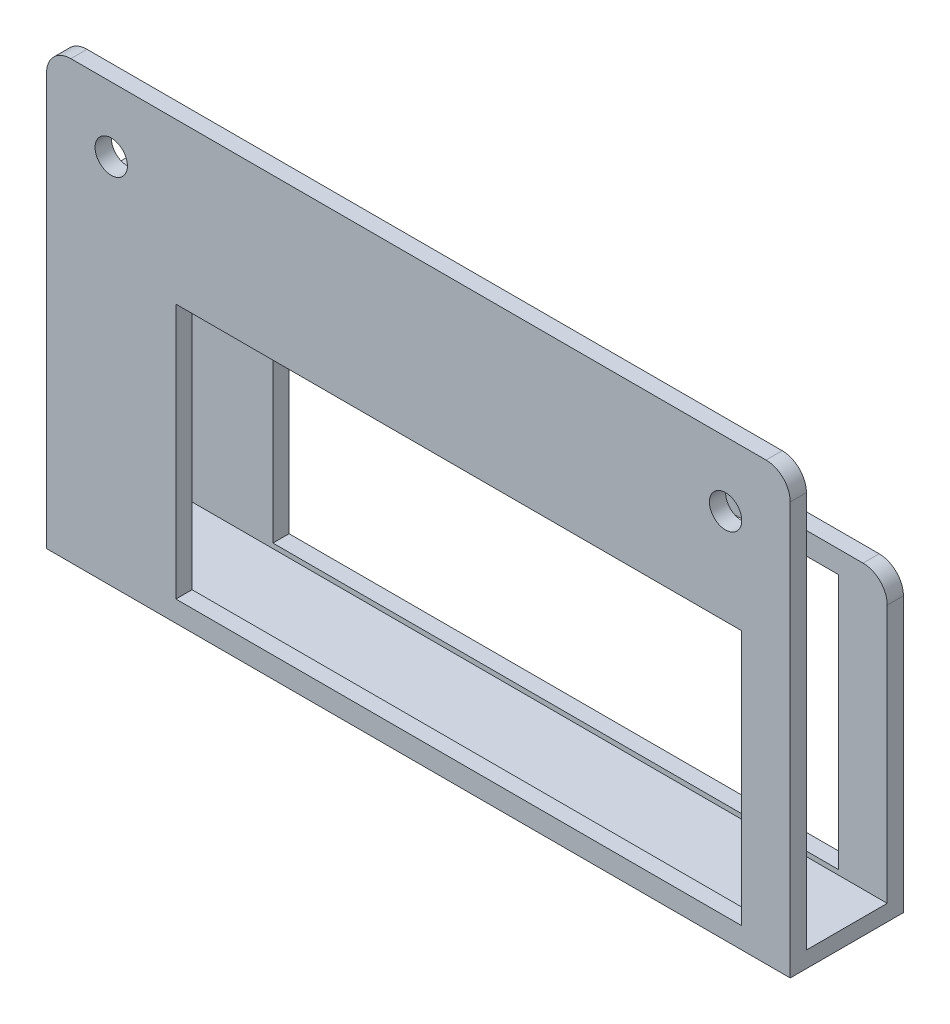
ISO-10303-21;
HEADER;
FILE_DESCRIPTION(('STEP AP214'),'2;1');
FILE_NAME('part.step','',(''),(''),'','','');
FILE_SCHEMA(('AUTOMOTIVE_DESIGN { 1 0 10303 214 1 1 1 1 }'));
ENDSEC;
DATA;
#1=APPLICATION_CONTEXT('core data for automotive mechanical design processes');
#2=APPLICATION_PROTOCOL_DEFINITION('international standard','automotive_design',2000,#1);
#3=PRODUCT_CONTEXT('',#1,'mechanical');
#4=PRODUCT('Part','Part','',(#3));
#5=PRODUCT_RELATED_PRODUCT_CATEGORY('part','',(#4));
#6=PRODUCT_DEFINITION_FORMATION('','',#4);
#7=PRODUCT_DEFINITION_CONTEXT('part definition',#1,'design');
#8=PRODUCT_DEFINITION('design','',#6,#7);
#9=PRODUCT_DEFINITION_SHAPE('','',#8);
#10=(LENGTH_UNIT() NAMED_UNIT(*) SI_UNIT(.MILLI.,.METRE.));
#11=(NAMED_UNIT(*) PLANE_ANGLE_UNIT() SI_UNIT($,.RADIAN.));
#12=(NAMED_UNIT(*) SI_UNIT($,.STERADIAN.) SOLID_ANGLE_UNIT());
#13=UNCERTAINTY_MEASURE_WITH_UNIT(LENGTH_MEASURE(1.E-05),#10,'distance_accuracy_value','');
#14=(GEOMETRIC_REPRESENTATION_CONTEXT(3) GLOBAL_UNCERTAINTY_ASSIGNED_CONTEXT((#13)) GLOBAL_UNIT_ASSIGNED_CONTEXT((#10,
#11,#12)) REPRESENTATION_CONTEXT('',''));
#15=CARTESIAN_POINT('',(0.,0.,0.));
#16=DIRECTION('',(0.,0.,1.));
#17=DIRECTION('',(1.,0.,0.));
#18=AXIS2_PLACEMENT_3D('',#15,#16,#17);
#19=CARTESIAN_POINT('',(-6.,34.2,14.));
#20=DIRECTION('',(-1.,0.,0.));
#21=DIRECTION('',(0.,-1.,0.));
#22=AXIS2_PLACEMENT_3D('',#19,#20,#21);
#23=PLANE('',#22);
#24=DIRECTION('',(0.,-1.,0.));
#25=VECTOR('',#24,1.);
#26=CARTESIAN_POINT('',(-6.,34.2,2.));
#27=LINE('',#26,#25);
#28=CARTESIAN_POINT('',(-6.00000000000001,34.2,2.));
#29=VERTEX_POINT('',#28);
#30=CARTESIAN_POINT('',(-5.99999999999999,2.6,1.99999999999999));
#31=VERTEX_POINT('',#30);
#32=EDGE_CURVE('E289',#29,#31,#27,.T.);
#33=ORIENTED_EDGE('',*,*,#32,.F.);
#34=DIRECTION('',(0.,0.,-1.));
#35=VECTOR('',#34,1.);
#36=CARTESIAN_POINT('',(-6.,34.2,14.));
#37=LINE('',#36,#35);
#38=CARTESIAN_POINT('',(-6.,34.2,0.));
#39=VERTEX_POINT('',#38);
#40=EDGE_CURVE('E330',#29,#39,#37,.T.);
#41=ORIENTED_EDGE('',*,*,#40,.T.);
#42=DIRECTION('',(0.,1.,0.));
#43=VECTOR('',#42,1.);
#44=CARTESIAN_POINT('',(-6.,34.2,0.));
#45=LINE('',#44,#43);
#46=CARTESIAN_POINT('',(-5.99999999999999,2.6,0.));
#47=VERTEX_POINT('',#46);
#48=EDGE_CURVE('E297',#47,#39,#45,.T.);
#49=ORIENTED_EDGE('',*,*,#48,.F.);
#50=DIRECTION('',(0.,0.,-1.));
#51=VECTOR('',#50,1.);
#52=CARTESIAN_POINT('',(-5.99999999999999,2.6,14.));
#53=LINE('',#52,#51);
#54=EDGE_CURVE('E308',#31,#47,#53,.T.);
#55=ORIENTED_EDGE('',*,*,#54,.F.);
#56=EDGE_LOOP('',(#33,#41,#49,#55));
#57=FACE_BOUND('',#56,.T.);
#58=ADVANCED_FACE('F33',(#57),#23,.T.);
#59=CARTESIAN_POINT('',(-76.,34.2,14.));
#60=DIRECTION('',(0.,-1.,0.));
#61=DIRECTION('',(0.,0.,-1.));
#62=AXIS2_PLACEMENT_3D('',#59,#60,#61);
#63=PLANE('',#62);
#64=DIRECTION('',(1.,0.,0.));
#65=VECTOR('',#64,1.);
#66=CARTESIAN_POINT('',(-76.,34.2,2.));
#67=LINE('',#66,#65);
#68=CARTESIAN_POINT('',(-76.,34.2,2.));
#69=VERTEX_POINT('',#68);
#70=EDGE_CURVE('E287',#69,#29,#67,.T.);
#71=ORIENTED_EDGE('',*,*,#70,.F.);
#72=DIRECTION('',(0.,0.,-1.));
#73=VECTOR('',#72,1.);
#74=CARTESIAN_POINT('',(-76.,34.2,14.));
#75=LINE('',#74,#73);
#76=CARTESIAN_POINT('',(-76.,34.2,0.));
#77=VERTEX_POINT('',#76);
#78=EDGE_CURVE('E326',#69,#77,#75,.T.);
#79=ORIENTED_EDGE('',*,*,#78,.T.);
#80=DIRECTION('',(-1.,0.,0.));
#81=VECTOR('',#80,1.);
#82=CARTESIAN_POINT('',(-76.,34.2,0.));
#83=LINE('',#82,#81);
#84=EDGE_CURVE('E311',#39,#77,#83,.T.);
#85=ORIENTED_EDGE('',*,*,#84,.F.);
#86=ORIENTED_EDGE('',*,*,#40,.F.);
#87=EDGE_LOOP('',(#71,#79,#85,#86));
#88=FACE_BOUND('',#87,.T.);
#89=ADVANCED_FACE('F437',(#88),#63,.T.);
#90=CARTESIAN_POINT('',(-76.,34.2,14.));
#91=DIRECTION('',(1.,0.,0.));
#92=DIRECTION('',(0.,0.,-1.));
#93=AXIS2_PLACEMENT_3D('',#90,#91,#92);
#94=PLANE('',#93);
#95=DIRECTION('',(0.,1.,0.));
#96=VECTOR('',#95,1.);
#97=CARTESIAN_POINT('',(-76.,34.2,2.));
#98=LINE('',#97,#96);
#99=CARTESIAN_POINT('',(-76.,2.6,1.99999999999999));
#100=VERTEX_POINT('',#99);
#101=EDGE_CURVE('E285',#100,#69,#98,.T.);
#102=ORIENTED_EDGE('',*,*,#101,.F.);
#103=DIRECTION('',(0.,0.,-1.));
#104=VECTOR('',#103,1.);
#105=CARTESIAN_POINT('',(-76.,2.6,14.));
#106=LINE('',#105,#104);
#107=CARTESIAN_POINT('',(-76.,2.6,0.));
#108=VERTEX_POINT('',#107);
#109=EDGE_CURVE('E322',#100,#108,#106,.T.);
#110=ORIENTED_EDGE('',*,*,#109,.T.);
#111=DIRECTION('',(0.,-1.,0.));
#112=VECTOR('',#111,1.);
#113=CARTESIAN_POINT('',(-76.,34.2,0.));
#114=LINE('',#113,#112);
#115=EDGE_CURVE('E314',#77,#108,#114,.T.);
#116=ORIENTED_EDGE('',*,*,#115,.F.);
#117=ORIENTED_EDGE('',*,*,#78,.F.);
#118=EDGE_LOOP('',(#102,#110,#116,#117));
#119=FACE_BOUND('',#118,.T.);
#120=ADVANCED_FACE('F444',(#119),#94,.T.);
#121=CARTESIAN_POINT('',(-76.,2.6,14.));
#122=DIRECTION('',(0.,1.,0.));
#123=DIRECTION('',(0.,0.,1.));
#124=AXIS2_PLACEMENT_3D('',#121,#122,#123);
#125=PLANE('',#124);
#126=DIRECTION('',(-1.,0.,0.));
#127=VECTOR('',#126,1.);
#128=CARTESIAN_POINT('',(-76.,2.6,1.99999999999999));
#129=LINE('',#128,#127);
#130=EDGE_CURVE('E355',#31,#100,#129,.T.);
#131=ORIENTED_EDGE('',*,*,#130,.F.);
#132=ORIENTED_EDGE('',*,*,#54,.T.);
#133=DIRECTION('',(1.,0.,0.));
#134=VECTOR('',#133,1.);
#135=CARTESIAN_POINT('',(-76.,2.6,0.));
#136=LINE('',#135,#134);
#137=EDGE_CURVE('E301',#108,#47,#136,.T.);
#138=ORIENTED_EDGE('',*,*,#137,.F.);
#139=ORIENTED_EDGE('',*,*,#109,.F.);
#140=EDGE_LOOP('',(#131,#132,#138,#139));
#141=FACE_BOUND('',#140,.T.);
#142=ADVANCED_FACE('F483',(#141),#125,.T.);
#143=CARTESIAN_POINT('',(0.,0.,14.));
#144=DIRECTION('',(0.,0.,1.));
#145=DIRECTION('',(1.,0.,0.));
#146=AXIS2_PLACEMENT_3D('',#143,#144,#145);
#147=PLANE('',#146);
#148=CARTESIAN_POINT('',(-84.,46.,14.));
#149=DIRECTION('',(0.,0.,1.));
#150=DIRECTION('',(1.,0.,0.));
#151=AXIS2_PLACEMENT_3D('',#148,#149,#150);
#152=CIRCLE('',#151,2.);
#153=CARTESIAN_POINT('',(-82.,46.,14.));
#154=VERTEX_POINT('',#153);
#155=EDGE_CURVE('E294',#154,#154,#152,.T.);
#156=ORIENTED_EDGE('',*,*,#155,.F.);
#157=EDGE_LOOP('',(#156));
#158=FACE_BOUND('',#157,.T.);
#159=DIRECTION('',(0.,1.,0.));
#160=VECTOR('',#159,1.);
#161=CARTESIAN_POINT('',(0.,54.,14.));
#162=LINE('',#161,#160);
#163=CARTESIAN_POINT('',(0.,0.,14.));
#164=VERTEX_POINT('',#163);
#165=CARTESIAN_POINT('',(0.,51.,14.));
#166=VERTEX_POINT('',#165);
#167=EDGE_CURVE('E335',#164,#166,#162,.T.);
#168=ORIENTED_EDGE('',*,*,#167,.T.);
#169=CARTESIAN_POINT('',(-3.,51.,14.));
#170=DIRECTION('',(0.,0.,1.));
#171=DIRECTION('',(1.,0.,0.));
#172=AXIS2_PLACEMENT_3D('',#169,#170,#171);
#173=CIRCLE('',#172,3.);
#174=CARTESIAN_POINT('',(-3.,54.,14.));
#175=VERTEX_POINT('',#174);
#176=EDGE_CURVE('E376',#166,#175,#173,.T.);
#177=ORIENTED_EDGE('',*,*,#176,.T.);
#178=DIRECTION('',(-1.,0.,0.));
#179=VECTOR('',#178,1.);
#180=CARTESIAN_POINT('',(-92.,54.,14.));
#181=LINE('',#180,#179);
#182=CARTESIAN_POINT('',(-89.,54.,14.));
#183=VERTEX_POINT('',#182);
#184=EDGE_CURVE('E338',#175,#183,#181,.T.);
#185=ORIENTED_EDGE('',*,*,#184,.T.);
#186=CARTESIAN_POINT('',(-89.,51.,14.));
#187=DIRECTION('',(0.,0.,1.));
#188=DIRECTION('',(1.,0.,0.));
#189=AXIS2_PLACEMENT_3D('',#186,#187,#188);
#190=CIRCLE('',#189,3.);
#191=CARTESIAN_POINT('',(-92.,51.,14.));
#192=VERTEX_POINT('',#191);
#193=EDGE_CURVE('E367',#183,#192,#190,.T.);
#194=ORIENTED_EDGE('',*,*,#193,.T.);
#195=DIRECTION('',(0.,-1.,0.));
#196=VECTOR('',#195,1.);
#197=CARTESIAN_POINT('',(-92.,54.,14.));
#198=LINE('',#197,#196);
#199=CARTESIAN_POINT('',(-92.,0.,14.));
#200=VERTEX_POINT('',#199);
#201=EDGE_CURVE('E341',#192,#200,#198,.T.);
#202=ORIENTED_EDGE('',*,*,#201,.T.);
#203=DIRECTION('',(1.,0.,0.));
#204=VECTOR('',#203,1.);
#205=CARTESIAN_POINT('',(-92.,0.,14.));
#206=LINE('',#205,#204);
#207=EDGE_CURVE('E343',#200,#164,#206,.T.);
#208=ORIENTED_EDGE('',*,*,#207,.T.);
#209=EDGE_LOOP('',(#168,#177,#185,#194,#202,#208));
#210=FACE_BOUND('',#209,.T.);
#211=DIRECTION('',(-1.,0.,0.));
#212=VECTOR('',#211,1.);
#213=CARTESIAN_POINT('',(-76.,34.2,14.));
#214=LINE('',#213,#212);
#215=CARTESIAN_POINT('',(-6.,34.2,14.));
#216=VERTEX_POINT('',#215);
#217=CARTESIAN_POINT('',(-76.,34.2,14.));
#218=VERTEX_POINT('',#217);
#219=EDGE_CURVE('E300',#216,#218,#214,.T.);
#220=ORIENTED_EDGE('',*,*,#219,.F.);
#221=DIRECTION('',(0.,1.,0.));
#222=VECTOR('',#221,1.);
#223=CARTESIAN_POINT('',(-6.,34.2,14.));
#224=LINE('',#223,#222);
#225=CARTESIAN_POINT('',(-5.99999999999999,2.6,14.));
#226=VERTEX_POINT('',#225);
#227=EDGE_CURVE('E298',#226,#216,#224,.T.);
#228=ORIENTED_EDGE('',*,*,#227,.F.);
#229=DIRECTION('',(1.,0.,0.));
#230=VECTOR('',#229,1.);
#231=CARTESIAN_POINT('',(-76.,2.6,14.));
#232=LINE('',#231,#230);
#233=CARTESIAN_POINT('',(-76.,2.6,14.));
#234=VERTEX_POINT('',#233);
#235=EDGE_CURVE('E306',#234,#226,#232,.T.);
#236=ORIENTED_EDGE('',*,*,#235,.F.);
#237=DIRECTION('',(0.,-1.,0.));
#238=VECTOR('',#237,1.);
#239=CARTESIAN_POINT('',(-76.,34.2,14.));
#240=LINE('',#239,#238);
#241=EDGE_CURVE('E303',#218,#234,#240,.T.);
#242=ORIENTED_EDGE('',*,*,#241,.F.);
#243=EDGE_LOOP('',(#220,#228,#236,#242));
#244=FACE_BOUND('',#243,.T.);
#245=CARTESIAN_POINT('',(-8.,46.,14.));
#246=DIRECTION('',(0.,0.,1.));
#247=DIRECTION('',(1.,0.,0.));
#248=AXIS2_PLACEMENT_3D('',#245,#246,#247);
#249=CIRCLE('',#248,2.);
#250=CARTESIAN_POINT('',(-6.,46.,14.));
#251=VERTEX_POINT('',#250);
#252=EDGE_CURVE('E291',#251,#251,#249,.T.);
#253=ORIENTED_EDGE('',*,*,#252,.F.);
#254=EDGE_LOOP('',(#253));
#255=FACE_BOUND('',#254,.T.);
#256=ADVANCED_FACE('F402',(#158,#210,#244,#255),#147,.T.);
#257=CARTESIAN_POINT('',(0.,0.,0.));
#258=DIRECTION('',(0.,0.,1.));
#259=DIRECTION('',(1.,0.,0.));
#260=AXIS2_PLACEMENT_3D('',#257,#258,#259);
#261=PLANE('',#260);
#262=DIRECTION('',(1.,0.,0.));
#263=VECTOR('',#262,1.);
#264=CARTESIAN_POINT('',(-90.,36.9530746983757,0.));
#265=LINE('',#264,#263);
#266=CARTESIAN_POINT('',(-92.,36.9530746983757,0.));
#267=VERTEX_POINT('',#266);
#268=CARTESIAN_POINT('',(-3.00000000000003,36.9530746983757,0.));
#269=VERTEX_POINT('',#268);
#270=EDGE_CURVE('E261',#267,#269,#265,.T.);
#271=ORIENTED_EDGE('',*,*,#270,.T.);
#272=CARTESIAN_POINT('',(-3.,33.9530746983757,0.));
#273=DIRECTION('',(0.,0.,1.));
#274=DIRECTION('',(1.,0.,0.));
#275=AXIS2_PLACEMENT_3D('',#272,#273,#274);
#276=CIRCLE('',#275,3.);
#277=CARTESIAN_POINT('',(0.,33.9530746983757,0.));
#278=VERTEX_POINT('',#277);
#279=EDGE_CURVE('E55',#269,#278,#276,.F.);
#280=ORIENTED_EDGE('',*,*,#279,.T.);
#281=DIRECTION('',(0.,1.,0.));
#282=VECTOR('',#281,1.);
#283=CARTESIAN_POINT('',(0.,54.,0.));
#284=LINE('',#283,#282);
#285=CARTESIAN_POINT('',(0.,0.,0.));
#286=VERTEX_POINT('',#285);
#287=EDGE_CURVE('E334',#286,#278,#284,.T.);
#288=ORIENTED_EDGE('',*,*,#287,.F.);
#289=DIRECTION('',(1.,0.,0.));
#290=VECTOR('',#289,1.);
#291=CARTESIAN_POINT('',(-92.,0.,0.));
#292=LINE('',#291,#290);
#293=CARTESIAN_POINT('',(-92.,0.,0.));
#294=VERTEX_POINT('',#293);
#295=EDGE_CURVE('E339',#294,#286,#292,.T.);
#296=ORIENTED_EDGE('',*,*,#295,.F.);
#297=DIRECTION('',(0.,-1.,0.));
#298=VECTOR('',#297,1.);
#299=CARTESIAN_POINT('',(-92.,54.,0.));
#300=LINE('',#299,#298);
#301=EDGE_CURVE('E347',#267,#294,#300,.T.);
#302=ORIENTED_EDGE('',*,*,#301,.F.);
#303=EDGE_LOOP('',(#271,#280,#288,#296,#302));
#304=FACE_BOUND('',#303,.T.);
#305=ORIENTED_EDGE('',*,*,#48,.T.);
#306=ORIENTED_EDGE('',*,*,#84,.T.);
#307=ORIENTED_EDGE('',*,*,#115,.T.);
#308=ORIENTED_EDGE('',*,*,#137,.T.);
#309=EDGE_LOOP('',(#305,#306,#307,#308));
#310=FACE_BOUND('',#309,.T.);
#311=ADVANCED_FACE('F388',(#304,#310),#261,.F.);
#312=CARTESIAN_POINT('',(0.,54.,14.));
#313=DIRECTION('',(-1.,0.,0.));
#314=DIRECTION('',(0.,-1.,0.));
#315=AXIS2_PLACEMENT_3D('',#312,#313,#314);
#316=PLANE('',#315);
#317=ORIENTED_EDGE('',*,*,#287,.T.);
#318=DIRECTION('',(0.,0.,-1.));
#319=VECTOR('',#318,1.);
#320=CARTESIAN_POINT('',(0.,33.9530746983757,14.0000000000001));
#321=LINE('',#320,#319);
#322=CARTESIAN_POINT('',(0.,33.9530746983757,2.));
#323=VERTEX_POINT('',#322);
#324=EDGE_CURVE('E41',#278,#323,#321,.F.);
#325=ORIENTED_EDGE('',*,*,#324,.T.);
#326=DIRECTION('',(0.,1.,0.));
#327=VECTOR('',#326,1.);
#328=CARTESIAN_POINT('',(0.,36.9530746983757,2.));
#329=LINE('',#328,#327);
#330=CARTESIAN_POINT('',(0.,2.,1.99999999999999));
#331=VERTEX_POINT('',#330);
#332=EDGE_CURVE('E249',#331,#323,#329,.T.);
#333=ORIENTED_EDGE('',*,*,#332,.F.);
#334=DIRECTION('',(0.,0.,-1.));
#335=VECTOR('',#334,1.);
#336=CARTESIAN_POINT('',(0.,2.,1.99999999999999));
#337=LINE('',#336,#335);
#338=CARTESIAN_POINT('',(0.,2.,12.));
#339=VERTEX_POINT('',#338);
#340=EDGE_CURVE('E257',#339,#331,#337,.T.);
#341=ORIENTED_EDGE('',*,*,#340,.F.);
#342=DIRECTION('',(0.,-1.,0.));
#343=VECTOR('',#342,1.);
#344=CARTESIAN_POINT('',(0.,2.,12.));
#345=LINE('',#344,#343);
#346=CARTESIAN_POINT('',(0.,51.,12.));
#347=VERTEX_POINT('',#346);
#348=EDGE_CURVE('E245',#347,#339,#345,.T.);
#349=ORIENTED_EDGE('',*,*,#348,.F.);
#350=DIRECTION('',(0.,0.,-1.));
#351=VECTOR('',#350,1.);
#352=CARTESIAN_POINT('',(0.,51.,14.));
#353=LINE('',#352,#351);
#354=EDGE_CURVE('E374',#347,#166,#353,.F.);
#355=ORIENTED_EDGE('',*,*,#354,.T.);
#356=ORIENTED_EDGE('',*,*,#167,.F.);
#357=DIRECTION('',(0.,0.,-1.));
#358=VECTOR('',#357,1.);
#359=CARTESIAN_POINT('',(0.,0.,14.));
#360=LINE('',#359,#358);
#361=EDGE_CURVE('E345',#164,#286,#360,.T.);
#362=ORIENTED_EDGE('',*,*,#361,.T.);
#363=EDGE_LOOP('',(#317,#325,#333,#341,#349,#355,#356,#362));
#364=FACE_BOUND('',#363,.T.);
#365=ADVANCED_FACE('F423',(#364),#316,.F.);
#366=CARTESIAN_POINT('',(-92.,54.,14.));
#367=DIRECTION('',(0.,-1.,0.));
#368=DIRECTION('',(0.,0.,-1.));
#369=AXIS2_PLACEMENT_3D('',#366,#367,#368);
#370=PLANE('',#369);
#371=ORIENTED_EDGE('',*,*,#184,.F.);
#372=DIRECTION('',(0.,0.,-1.));
#373=VECTOR('',#372,1.);
#374=CARTESIAN_POINT('',(-3.,54.,14.));
#375=LINE('',#374,#373);
#376=CARTESIAN_POINT('',(-3.00000000000003,54.,12.));
#377=VERTEX_POINT('',#376);
#378=EDGE_CURVE('E369',#175,#377,#375,.T.);
#379=ORIENTED_EDGE('',*,*,#378,.T.);
#380=DIRECTION('',(1.,0.,0.));
#381=VECTOR('',#380,1.);
#382=CARTESIAN_POINT('',(-90.,54.,12.));
#383=LINE('',#382,#381);
#384=CARTESIAN_POINT('',(-89.,54.,12.));
#385=VERTEX_POINT('',#384);
#386=EDGE_CURVE('E255',#385,#377,#383,.T.);
#387=ORIENTED_EDGE('',*,*,#386,.F.);
#388=DIRECTION('',(0.,0.,-1.));
#389=VECTOR('',#388,1.);
#390=CARTESIAN_POINT('',(-89.,54.,14.));
#391=LINE('',#390,#389);
#392=EDGE_CURVE('E364',#385,#183,#391,.F.);
#393=ORIENTED_EDGE('',*,*,#392,.T.);
#394=EDGE_LOOP('',(#371,#379,#387,#393));
#395=FACE_BOUND('',#394,.T.);
#396=ADVANCED_FACE('F415',(#395),#370,.F.);
#397=CARTESIAN_POINT('',(-92.,54.,14.));
#398=DIRECTION('',(1.,0.,0.));
#399=DIRECTION('',(0.,0.,-1.));
#400=AXIS2_PLACEMENT_3D('',#397,#398,#399);
#401=PLANE('',#400);
#402=DIRECTION('',(0.,1.,0.));
#403=VECTOR('',#402,1.);
#404=CARTESIAN_POINT('',(-92.,2.34088481550635,11.));
#405=LINE('',#404,#403);
#406=CARTESIAN_POINT('',(-92.,2.34088481550635,11.));
#407=VERTEX_POINT('',#406);
#408=CARTESIAN_POINT('',(-92.,15.3408848155063,11.));
#409=VERTEX_POINT('',#408);
#410=EDGE_CURVE('E219',#407,#409,#405,.T.);
#411=ORIENTED_EDGE('',*,*,#410,.F.);
#412=DIRECTION('',(0.,0.,1.));
#413=VECTOR('',#412,1.);
#414=CARTESIAN_POINT('',(-92.,2.34088481550635,3.));
#415=LINE('',#414,#413);
#416=CARTESIAN_POINT('',(-92.,2.34088481550635,3.));
#417=VERTEX_POINT('',#416);
#418=EDGE_CURVE('E211',#417,#407,#415,.T.);
#419=ORIENTED_EDGE('',*,*,#418,.F.);
#420=DIRECTION('',(0.,-1.,0.));
#421=VECTOR('',#420,1.);
#422=CARTESIAN_POINT('',(-92.,2.34088481550635,3.));
#423=LINE('',#422,#421);
#424=CARTESIAN_POINT('',(-92.,15.3408848155063,3.));
#425=VERTEX_POINT('',#424);
#426=EDGE_CURVE('E223',#425,#417,#423,.T.);
#427=ORIENTED_EDGE('',*,*,#426,.F.);
#428=DIRECTION('',(0.,0.,-1.));
#429=VECTOR('',#428,1.);
#430=CARTESIAN_POINT('',(-92.,15.3408848155063,3.));
#431=LINE('',#430,#429);
#432=EDGE_CURVE('E217',#409,#425,#431,.T.);
#433=ORIENTED_EDGE('',*,*,#432,.F.);
#434=EDGE_LOOP('',(#411,#419,#427,#433));
#435=FACE_BOUND('',#434,.T.);
#436=ORIENTED_EDGE('',*,*,#201,.F.);
#437=DIRECTION('',(0.,0.,-1.));
#438=VECTOR('',#437,1.);
#439=CARTESIAN_POINT('',(-92.,51.,14.));
#440=LINE('',#439,#438);
#441=CARTESIAN_POINT('',(-92.,51.,12.));
#442=VERTEX_POINT('',#441);
#443=EDGE_CURVE('E359',#192,#442,#440,.T.);
#444=ORIENTED_EDGE('',*,*,#443,.T.);
#445=DIRECTION('',(0.,1.,0.));
#446=VECTOR('',#445,1.);
#447=CARTESIAN_POINT('',(-92.,36.9530746983757,12.));
#448=LINE('',#447,#446);
#449=CARTESIAN_POINT('',(-92.,36.9530746983757,12.));
#450=VERTEX_POINT('',#449);
#451=EDGE_CURVE('E238',#450,#442,#448,.T.);
#452=ORIENTED_EDGE('',*,*,#451,.F.);
#453=DIRECTION('',(0.,0.,-1.));
#454=VECTOR('',#453,1.);
#455=CARTESIAN_POINT('',(-92.,36.9530746983757,29.1638475360031));
#456=LINE('',#455,#454);
#457=EDGE_CURVE('E237',#450,#267,#456,.T.);
#458=ORIENTED_EDGE('',*,*,#457,.T.);
#459=ORIENTED_EDGE('',*,*,#301,.T.);
#460=DIRECTION('',(0.,0.,-1.));
#461=VECTOR('',#460,1.);
#462=CARTESIAN_POINT('',(-92.,0.,14.));
#463=LINE('',#462,#461);
#464=EDGE_CURVE('E352',#200,#294,#463,.T.);
#465=ORIENTED_EDGE('',*,*,#464,.F.);
#466=EDGE_LOOP('',(#436,#444,#452,#458,#459,#465));
#467=FACE_BOUND('',#466,.T.);
#468=ADVANCED_FACE('F394',(#435,#467),#401,.F.);
#469=CARTESIAN_POINT('',(-92.,0.,14.));
#470=DIRECTION('',(0.,1.,0.));
#471=DIRECTION('',(0.,0.,1.));
#472=AXIS2_PLACEMENT_3D('',#469,#470,#471);
#473=PLANE('',#472);
#474=ORIENTED_EDGE('',*,*,#295,.T.);
#475=ORIENTED_EDGE('',*,*,#361,.F.);
#476=ORIENTED_EDGE('',*,*,#207,.F.);
#477=ORIENTED_EDGE('',*,*,#464,.T.);
#478=EDGE_LOOP('',(#474,#475,#476,#477));
#479=FACE_BOUND('',#478,.T.);
#480=ADVANCED_FACE('F398',(#479),#473,.F.);
#481=DIRECTION('',(0.,1.,0.));
#482=VECTOR('',#481,1.);
#483=CARTESIAN_POINT('',(-6.,34.2,12.));
#484=LINE('',#483,#482);
#485=CARTESIAN_POINT('',(-5.99999999999999,2.6,12.));
#486=VERTEX_POINT('',#485);
#487=CARTESIAN_POINT('',(-6.00000000000001,34.2,12.));
#488=VERTEX_POINT('',#487);
#489=EDGE_CURVE('E283',#486,#488,#484,.T.);
#490=ORIENTED_EDGE('',*,*,#489,.F.);
#491=EDGE_CURVE('E319',#226,#486,#53,.T.);
#492=ORIENTED_EDGE('',*,*,#491,.F.);
#493=ORIENTED_EDGE('',*,*,#227,.T.);
#494=EDGE_CURVE('E331',#216,#488,#37,.T.);
#495=ORIENTED_EDGE('',*,*,#494,.T.);
#496=EDGE_LOOP('',(#490,#492,#493,#495));
#497=FACE_BOUND('',#496,.T.);
#498=ADVANCED_FACE('F440',(#497),#23,.T.);
#499=DIRECTION('',(-1.,0.,0.));
#500=VECTOR('',#499,1.);
#501=CARTESIAN_POINT('',(-76.,34.2,12.));
#502=LINE('',#501,#500);
#503=CARTESIAN_POINT('',(-76.,34.2,12.));
#504=VERTEX_POINT('',#503);
#505=EDGE_CURVE('E281',#488,#504,#502,.T.);
#506=ORIENTED_EDGE('',*,*,#505,.F.);
#507=ORIENTED_EDGE('',*,*,#494,.F.);
#508=ORIENTED_EDGE('',*,*,#219,.T.);
#509=EDGE_CURVE('E327',#218,#504,#75,.T.);
#510=ORIENTED_EDGE('',*,*,#509,.T.);
#511=EDGE_LOOP('',(#506,#507,#508,#510));
#512=FACE_BOUND('',#511,.T.);
#513=ADVANCED_FACE('F447',(#512),#63,.T.);
#514=DIRECTION('',(0.,-1.,0.));
#515=VECTOR('',#514,1.);
#516=CARTESIAN_POINT('',(-76.,34.2,12.));
#517=LINE('',#516,#515);
#518=CARTESIAN_POINT('',(-76.,2.6,12.));
#519=VERTEX_POINT('',#518);
#520=EDGE_CURVE('E279',#504,#519,#517,.T.);
#521=ORIENTED_EDGE('',*,*,#520,.F.);
#522=ORIENTED_EDGE('',*,*,#509,.F.);
#523=ORIENTED_EDGE('',*,*,#241,.T.);
#524=EDGE_CURVE('E323',#234,#519,#106,.T.);
#525=ORIENTED_EDGE('',*,*,#524,.T.);
#526=EDGE_LOOP('',(#521,#522,#523,#525));
#527=FACE_BOUND('',#526,.T.);
#528=ADVANCED_FACE('F456',(#527),#94,.T.);
#529=DIRECTION('',(1.,0.,0.));
#530=VECTOR('',#529,1.);
#531=CARTESIAN_POINT('',(-76.,2.6,12.));
#532=LINE('',#531,#530);
#533=EDGE_CURVE('E277',#519,#486,#532,.T.);
#534=ORIENTED_EDGE('',*,*,#533,.F.);
#535=ORIENTED_EDGE('',*,*,#524,.F.);
#536=ORIENTED_EDGE('',*,*,#235,.T.);
#537=ORIENTED_EDGE('',*,*,#491,.T.);
#538=EDGE_LOOP('',(#534,#535,#536,#537));
#539=FACE_BOUND('',#538,.T.);
#540=ADVANCED_FACE('F467',(#539),#125,.T.);
#541=CARTESIAN_POINT('',(-84.,46.,14.));
#542=DIRECTION('',(0.,0.,-1.));
#543=DIRECTION('',(-1.,0.,0.));
#544=AXIS2_PLACEMENT_3D('',#541,#542,#543);
#545=CYLINDRICAL_SURFACE('',#544,2.);
#546=CARTESIAN_POINT('',(-84.,46.,12.));
#547=DIRECTION('',(0.,0.,1.));
#548=DIRECTION('',(1.,0.,0.));
#549=AXIS2_PLACEMENT_3D('',#546,#547,#548);
#550=CIRCLE('',#549,2.);
#551=CARTESIAN_POINT('',(-82.,46.,12.));
#552=VERTEX_POINT('',#551);
#553=EDGE_CURVE('E274',#552,#552,#550,.T.);
#554=ORIENTED_EDGE('',*,*,#553,.F.);
#555=EDGE_LOOP('',(#554));
#556=FACE_BOUND('',#555,.T.);
#557=ORIENTED_EDGE('',*,*,#155,.T.);
#558=EDGE_LOOP('',(#557));
#559=FACE_BOUND('',#558,.T.);
#560=ADVANCED_FACE('F481',(#556,#559),#545,.F.);
#561=CARTESIAN_POINT('',(-8.,46.,14.));
#562=DIRECTION('',(0.,0.,-1.));
#563=DIRECTION('',(-1.,0.,0.));
#564=AXIS2_PLACEMENT_3D('',#561,#562,#563);
#565=CYLINDRICAL_SURFACE('',#564,2.);
#566=CARTESIAN_POINT('',(-8.,46.,12.));
#567=DIRECTION('',(0.,0.,1.));
#568=DIRECTION('',(1.,0.,0.));
#569=AXIS2_PLACEMENT_3D('',#566,#567,#568);
#570=CIRCLE('',#569,2.);
#571=CARTESIAN_POINT('',(-6.,46.,12.));
#572=VERTEX_POINT('',#571);
#573=EDGE_CURVE('E263',#572,#572,#570,.T.);
#574=ORIENTED_EDGE('',*,*,#573,.F.);
#575=EDGE_LOOP('',(#574));
#576=FACE_BOUND('',#575,.T.);
#577=ORIENTED_EDGE('',*,*,#252,.T.);
#578=EDGE_LOOP('',(#577));
#579=FACE_BOUND('',#578,.T.);
#580=ADVANCED_FACE('F509',(#576,#579),#565,.F.);
#581=CARTESIAN_POINT('',(-90.,36.9530746983757,2.));
#582=DIRECTION('',(0.,-1.,0.));
#583=DIRECTION('',(0.,0.,-1.));
#584=AXIS2_PLACEMENT_3D('',#581,#582,#583);
#585=PLANE('',#584);
#586=DIRECTION('',(1.,0.,0.));
#587=VECTOR('',#586,1.);
#588=CARTESIAN_POINT('',(-90.,36.9530746983757,2.));
#589=LINE('',#588,#587);
#590=CARTESIAN_POINT('',(-90.,36.9530746983757,2.));
#591=VERTEX_POINT('',#590);
#592=CARTESIAN_POINT('',(-3.00000000000003,36.9530746983757,2.));
#593=VERTEX_POINT('',#592);
#594=EDGE_CURVE('E264',#591,#593,#589,.T.);
#595=ORIENTED_EDGE('',*,*,#594,.T.);
#596=DIRECTION('',(0.,0.,-1.));
#597=VECTOR('',#596,1.);
#598=CARTESIAN_POINT('',(-3.,36.9530746983757,2.));
#599=LINE('',#598,#597);
#600=EDGE_CURVE('E378',#593,#269,#599,.T.);
#601=ORIENTED_EDGE('',*,*,#600,.T.);
#602=ORIENTED_EDGE('',*,*,#270,.F.);
#603=ORIENTED_EDGE('',*,*,#457,.F.);
#604=DIRECTION('',(-1.,0.,0.));
#605=VECTOR('',#604,1.);
#606=CARTESIAN_POINT('',(-90.,36.9530746983757,12.));
#607=LINE('',#606,#605);
#608=CARTESIAN_POINT('',(-90.,36.9530746983757,12.));
#609=VERTEX_POINT('',#608);
#610=EDGE_CURVE('E234',#609,#450,#607,.T.);
#611=ORIENTED_EDGE('',*,*,#610,.F.);
#612=DIRECTION('',(0.,0.,-1.));
#613=VECTOR('',#612,1.);
#614=CARTESIAN_POINT('',(-90.,36.9530746983757,29.1638475360031));
#615=LINE('',#614,#613);
#616=EDGE_CURVE('E241',#609,#591,#615,.T.);
#617=ORIENTED_EDGE('',*,*,#616,.T.);
#618=EDGE_LOOP('',(#595,#601,#602,#603,#611,#617));
#619=FACE_BOUND('',#618,.T.);
#620=ADVANCED_FACE('F383',(#619),#585,.F.);
#621=CARTESIAN_POINT('',(-90.,36.9530746983757,2.));
#622=DIRECTION('',(0.,0.,-1.));
#623=DIRECTION('',(0.,1.,0.));
#624=AXIS2_PLACEMENT_3D('',#621,#622,#623);
#625=PLANE('',#624);
#626=ORIENTED_EDGE('',*,*,#32,.T.);
#627=ORIENTED_EDGE('',*,*,#130,.T.);
#628=ORIENTED_EDGE('',*,*,#101,.T.);
#629=ORIENTED_EDGE('',*,*,#70,.T.);
#630=EDGE_LOOP('',(#626,#627,#628,#629));
#631=FACE_BOUND('',#630,.T.);
#632=ORIENTED_EDGE('',*,*,#332,.T.);
#633=CARTESIAN_POINT('',(-3.,33.9530746983757,2.));
#634=DIRECTION('',(0.,0.,-1.));
#635=DIRECTION('',(0.,1.,0.));
#636=AXIS2_PLACEMENT_3D('',#633,#634,#635);
#637=CIRCLE('',#636,3.);
#638=EDGE_CURVE('E11',#323,#593,#637,.F.);
#639=ORIENTED_EDGE('',*,*,#638,.T.);
#640=ORIENTED_EDGE('',*,*,#594,.F.);
#641=DIRECTION('',(0.,1.,0.));
#642=VECTOR('',#641,1.);
#643=CARTESIAN_POINT('',(-90.,36.9530746983757,2.));
#644=LINE('',#643,#642);
#645=CARTESIAN_POINT('',(-90.,1.99999999999999,1.99999999999999));
#646=VERTEX_POINT('',#645);
#647=EDGE_CURVE('E252',#646,#591,#644,.T.);
#648=ORIENTED_EDGE('',*,*,#647,.F.);
#649=DIRECTION('',(1.,0.,0.));
#650=VECTOR('',#649,1.);
#651=CARTESIAN_POINT('',(-90.,1.99999999999999,1.99999999999999));
#652=LINE('',#651,#650);
#653=EDGE_CURVE('E267',#646,#331,#652,.T.);
#654=ORIENTED_EDGE('',*,*,#653,.T.);
#655=EDGE_LOOP('',(#632,#639,#640,#648,#654));
#656=FACE_BOUND('',#655,.T.);
#657=ADVANCED_FACE('F431',(#631,#656),#625,.F.);
#658=CARTESIAN_POINT('',(-90.,1.99999999999999,1.99999999999999));
#659=DIRECTION('',(0.,-1.,0.));
#660=DIRECTION('',(0.,0.,-1.));
#661=AXIS2_PLACEMENT_3D('',#658,#659,#660);
#662=PLANE('',#661);
#663=ORIENTED_EDGE('',*,*,#340,.T.);
#664=ORIENTED_EDGE('',*,*,#653,.F.);
#665=DIRECTION('',(0.,0.,-1.));
#666=VECTOR('',#665,1.);
#667=CARTESIAN_POINT('',(-90.,1.99999999999999,1.99999999999999));
#668=LINE('',#667,#666);
#669=CARTESIAN_POINT('',(-90.,1.99999999999999,12.));
#670=VERTEX_POINT('',#669);
#671=EDGE_CURVE('E248',#670,#646,#668,.T.);
#672=ORIENTED_EDGE('',*,*,#671,.F.);
#673=DIRECTION('',(1.,0.,0.));
#674=VECTOR('',#673,1.);
#675=CARTESIAN_POINT('',(-90.,1.99999999999999,12.));
#676=LINE('',#675,#674);
#677=EDGE_CURVE('E269',#670,#339,#676,.T.);
#678=ORIENTED_EDGE('',*,*,#677,.T.);
#679=EDGE_LOOP('',(#663,#664,#672,#678));
#680=FACE_BOUND('',#679,.T.);
#681=ADVANCED_FACE('F425',(#680),#662,.F.);
#682=CARTESIAN_POINT('',(-90.,1.99999999999999,12.));
#683=DIRECTION('',(0.,0.,1.));
#684=DIRECTION('',(1.,0.,0.));
#685=AXIS2_PLACEMENT_3D('',#682,#683,#684);
#686=PLANE('',#685);
#687=ORIENTED_EDGE('',*,*,#489,.T.);
#688=ORIENTED_EDGE('',*,*,#505,.T.);
#689=ORIENTED_EDGE('',*,*,#520,.T.);
#690=ORIENTED_EDGE('',*,*,#533,.T.);
#691=EDGE_LOOP('',(#687,#688,#689,#690));
#692=FACE_BOUND('',#691,.T.);
#693=ORIENTED_EDGE('',*,*,#553,.T.);
#694=EDGE_LOOP('',(#693));
#695=FACE_BOUND('',#694,.T.);
#696=ORIENTED_EDGE('',*,*,#573,.T.);
#697=EDGE_LOOP('',(#696));
#698=FACE_BOUND('',#697,.T.);
#699=ORIENTED_EDGE('',*,*,#386,.T.);
#700=CARTESIAN_POINT('',(-3.,51.,12.));
#701=DIRECTION('',(0.,0.,1.));
#702=DIRECTION('',(1.,0.,0.));
#703=AXIS2_PLACEMENT_3D('',#700,#701,#702);
#704=CIRCLE('',#703,3.);
#705=EDGE_CURVE('E372',#377,#347,#704,.F.);
#706=ORIENTED_EDGE('',*,*,#705,.T.);
#707=ORIENTED_EDGE('',*,*,#348,.T.);
#708=ORIENTED_EDGE('',*,*,#677,.F.);
#709=DIRECTION('',(0.,-1.,0.));
#710=VECTOR('',#709,1.);
#711=CARTESIAN_POINT('',(-90.,36.9530746983757,12.));
#712=LINE('',#711,#710);
#713=EDGE_CURVE('E246',#609,#670,#712,.T.);
#714=ORIENTED_EDGE('',*,*,#713,.F.);
#715=ORIENTED_EDGE('',*,*,#610,.T.);
#716=ORIENTED_EDGE('',*,*,#451,.T.);
#717=CARTESIAN_POINT('',(-89.,51.,12.));
#718=DIRECTION('',(0.,0.,1.));
#719=DIRECTION('',(1.,0.,0.));
#720=AXIS2_PLACEMENT_3D('',#717,#718,#719);
#721=CIRCLE('',#720,3.);
#722=EDGE_CURVE('E362',#442,#385,#721,.F.);
#723=ORIENTED_EDGE('',*,*,#722,.T.);
#724=EDGE_LOOP('',(#699,#706,#707,#708,#714,#715,#716,#723));
#725=FACE_BOUND('',#724,.T.);
#726=ADVANCED_FACE('F412',(#692,#695,#698,#725),#686,.F.);
#727=CARTESIAN_POINT('',(-90.,0.,0.));
#728=DIRECTION('',(1.,0.,0.));
#729=DIRECTION('',(0.,1.,0.));
#730=AXIS2_PLACEMENT_3D('',#727,#728,#729);
#731=PLANE('',#730);
#732=DIRECTION('',(0.,0.,1.));
#733=VECTOR('',#732,1.);
#734=CARTESIAN_POINT('',(-90.,2.34088481550635,3.));
#735=LINE('',#734,#733);
#736=CARTESIAN_POINT('',(-90.,2.34088481550635,3.));
#737=VERTEX_POINT('',#736);
#738=CARTESIAN_POINT('',(-90.,2.34088481550635,11.));
#739=VERTEX_POINT('',#738);
#740=EDGE_CURVE('E208',#737,#739,#735,.T.);
#741=ORIENTED_EDGE('',*,*,#740,.T.);
#742=DIRECTION('',(0.,1.,0.));
#743=VECTOR('',#742,1.);
#744=CARTESIAN_POINT('',(-90.,2.34088481550635,11.));
#745=LINE('',#744,#743);
#746=CARTESIAN_POINT('',(-90.,15.3408848155063,11.));
#747=VERTEX_POINT('',#746);
#748=EDGE_CURVE('E194',#739,#747,#745,.T.);
#749=ORIENTED_EDGE('',*,*,#748,.T.);
#750=DIRECTION('',(0.,0.,-1.));
#751=VECTOR('',#750,1.);
#752=CARTESIAN_POINT('',(-90.,15.3408848155063,3.));
#753=LINE('',#752,#751);
#754=CARTESIAN_POINT('',(-90.,15.3408848155063,3.));
#755=VERTEX_POINT('',#754);
#756=EDGE_CURVE('E228',#747,#755,#753,.T.);
#757=ORIENTED_EDGE('',*,*,#756,.T.);
#758=DIRECTION('',(0.,-1.,0.));
#759=VECTOR('',#758,1.);
#760=CARTESIAN_POINT('',(-90.,2.34088481550635,3.));
#761=LINE('',#760,#759);
#762=EDGE_CURVE('E216',#755,#737,#761,.T.);
#763=ORIENTED_EDGE('',*,*,#762,.T.);
#764=EDGE_LOOP('',(#741,#749,#757,#763));
#765=FACE_BOUND('',#764,.T.);
#766=ORIENTED_EDGE('',*,*,#616,.F.);
#767=ORIENTED_EDGE('',*,*,#713,.T.);
#768=ORIENTED_EDGE('',*,*,#671,.T.);
#769=ORIENTED_EDGE('',*,*,#647,.T.);
#770=EDGE_LOOP('',(#766,#767,#768,#769));
#771=FACE_BOUND('',#770,.T.);
#772=ADVANCED_FACE('F214',(#765,#771),#731,.T.);
#773=CARTESIAN_POINT('',(-74.7356624775262,2.34088481550635,3.));
#774=DIRECTION('',(0.,-1.,0.));
#775=DIRECTION('',(0.,0.,-1.));
#776=AXIS2_PLACEMENT_3D('',#773,#774,#775);
#777=PLANE('',#776);
#778=DIRECTION('',(-1.,0.,0.));
#779=VECTOR('',#778,1.);
#780=CARTESIAN_POINT('',(-74.7356624775262,2.34088481550635,3.));
#781=LINE('',#780,#779);
#782=EDGE_CURVE('E226',#737,#417,#781,.T.);
#783=ORIENTED_EDGE('',*,*,#782,.T.);
#784=ORIENTED_EDGE('',*,*,#418,.T.);
#785=DIRECTION('',(-1.,0.,0.));
#786=VECTOR('',#785,1.);
#787=CARTESIAN_POINT('',(-74.7356624775262,2.34088481550635,11.));
#788=LINE('',#787,#786);
#789=EDGE_CURVE('E198',#739,#407,#788,.T.);
#790=ORIENTED_EDGE('',*,*,#789,.F.);
#791=ORIENTED_EDGE('',*,*,#740,.F.);
#792=EDGE_LOOP('',(#783,#784,#790,#791));
#793=FACE_BOUND('',#792,.T.);
#794=ADVANCED_FACE('F207',(#793),#777,.F.);
#795=CARTESIAN_POINT('',(-74.7356624775262,2.34088481550635,11.));
#796=DIRECTION('',(0.,0.,1.));
#797=DIRECTION('',(1.,0.,0.));
#798=AXIS2_PLACEMENT_3D('',#795,#796,#797);
#799=PLANE('',#798);
#800=ORIENTED_EDGE('',*,*,#789,.T.);
#801=ORIENTED_EDGE('',*,*,#410,.T.);
#802=DIRECTION('',(-1.,0.,0.));
#803=VECTOR('',#802,1.);
#804=CARTESIAN_POINT('',(-74.7356624775262,15.3408848155063,11.));
#805=LINE('',#804,#803);
#806=EDGE_CURVE('E200',#747,#409,#805,.T.);
#807=ORIENTED_EDGE('',*,*,#806,.F.);
#808=ORIENTED_EDGE('',*,*,#748,.F.);
#809=EDGE_LOOP('',(#800,#801,#807,#808));
#810=FACE_BOUND('',#809,.T.);
#811=ADVANCED_FACE('F196',(#810),#799,.F.);
#812=CARTESIAN_POINT('',(-74.7356624775262,15.3408848155063,3.));
#813=DIRECTION('',(0.,1.,0.));
#814=DIRECTION('',(0.,0.,1.));
#815=AXIS2_PLACEMENT_3D('',#812,#813,#814);
#816=PLANE('',#815);
#817=ORIENTED_EDGE('',*,*,#806,.T.);
#818=ORIENTED_EDGE('',*,*,#432,.T.);
#819=DIRECTION('',(-1.,0.,0.));
#820=VECTOR('',#819,1.);
#821=CARTESIAN_POINT('',(-74.7356624775262,15.3408848155063,3.));
#822=LINE('',#821,#820);
#823=EDGE_CURVE('E227',#755,#425,#822,.T.);
#824=ORIENTED_EDGE('',*,*,#823,.F.);
#825=ORIENTED_EDGE('',*,*,#756,.F.);
#826=EDGE_LOOP('',(#817,#818,#824,#825));
#827=FACE_BOUND('',#826,.T.);
#828=ADVANCED_FACE('F544',(#827),#816,.F.);
#829=CARTESIAN_POINT('',(-74.7356624775262,2.34088481550635,3.));
#830=DIRECTION('',(0.,0.,-1.));
#831=DIRECTION('',(-1.,0.,0.));
#832=AXIS2_PLACEMENT_3D('',#829,#830,#831);
#833=PLANE('',#832);
#834=ORIENTED_EDGE('',*,*,#823,.T.);
#835=ORIENTED_EDGE('',*,*,#426,.T.);
#836=ORIENTED_EDGE('',*,*,#782,.F.);
#837=ORIENTED_EDGE('',*,*,#762,.F.);
#838=EDGE_LOOP('',(#834,#835,#836,#837));
#839=FACE_BOUND('',#838,.T.);
#840=ADVANCED_FACE('F540',(#839),#833,.F.);
#841=CARTESIAN_POINT('',(-89.,51.,14.));
#842=DIRECTION('',(0.,0.,-1.));
#843=DIRECTION('',(-1.,0.,0.));
#844=AXIS2_PLACEMENT_3D('',#841,#842,#843);
#845=CYLINDRICAL_SURFACE('',#844,3.);
#846=ORIENTED_EDGE('',*,*,#193,.F.);
#847=ORIENTED_EDGE('',*,*,#392,.F.);
#848=ORIENTED_EDGE('',*,*,#722,.F.);
#849=ORIENTED_EDGE('',*,*,#443,.F.);
#850=EDGE_LOOP('',(#846,#847,#848,#849));
#851=FACE_BOUND('',#850,.T.);
#852=ADVANCED_FACE('F408',(#851),#845,.T.);
#853=CARTESIAN_POINT('',(-3.,51.,14.));
#854=DIRECTION('',(0.,0.,-1.));
#855=DIRECTION('',(-1.,0.,0.));
#856=AXIS2_PLACEMENT_3D('',#853,#854,#855);
#857=CYLINDRICAL_SURFACE('',#856,3.);
#858=ORIENTED_EDGE('',*,*,#176,.F.);
#859=ORIENTED_EDGE('',*,*,#354,.F.);
#860=ORIENTED_EDGE('',*,*,#705,.F.);
#861=ORIENTED_EDGE('',*,*,#378,.F.);
#862=EDGE_LOOP('',(#858,#859,#860,#861));
#863=FACE_BOUND('',#862,.T.);
#864=ADVANCED_FACE('F418',(#863),#857,.T.);
#865=CARTESIAN_POINT('',(-3.,33.9530746983757,2.00000000000001));
#866=DIRECTION('',(0.,0.,-1.));
#867=DIRECTION('',(0.,1.,0.));
#868=AXIS2_PLACEMENT_3D('',#865,#866,#867);
#869=CYLINDRICAL_SURFACE('',#868,3.);
#870=ORIENTED_EDGE('',*,*,#638,.F.);
#871=ORIENTED_EDGE('',*,*,#324,.F.);
#872=ORIENTED_EDGE('',*,*,#279,.F.);
#873=ORIENTED_EDGE('',*,*,#600,.F.);
#874=EDGE_LOOP('',(#870,#871,#872,#873));
#875=FACE_BOUND('',#874,.T.);
#876=ADVANCED_FACE('F35',(#875),#869,.T.);
#877=CLOSED_SHELL('',(#58,#89,#120,#142,#256,#311,#365,#396,#468,#480,#498,#513,#528,#540,#560,
#580,#620,#657,#681,#726,#772,#794,#811,#828,#840,#852,#864,#876));
#878=MANIFOLD_SOLID_BREP('B2',#877);
#879=ADVANCED_BREP_SHAPE_REPRESENTATION('',(#18,#878),#14);
#880=SHAPE_DEFINITION_REPRESENTATION(#9,#879);
ENDSEC;
END-ISO-10303-21;
